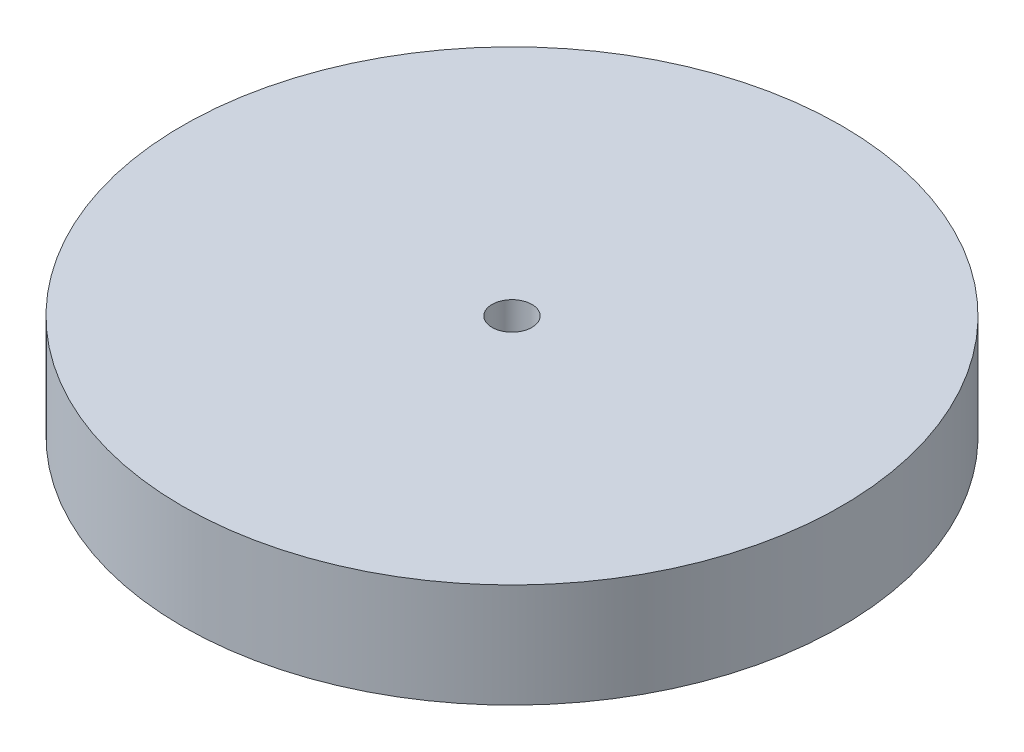
ISO-10303-21;
HEADER;
FILE_DESCRIPTION(('STEP AP214'),'2;1');
FILE_NAME('part.step','',(''),(''),'','','');
FILE_SCHEMA(('AUTOMOTIVE_DESIGN { 1 0 10303 214 1 1 1 1 }'));
ENDSEC;
DATA;
#1=APPLICATION_CONTEXT('core data for automotive mechanical design processes');
#2=APPLICATION_PROTOCOL_DEFINITION('international standard','automotive_design',2000,#1);
#3=PRODUCT_CONTEXT('',#1,'mechanical');
#4=PRODUCT('Part','Part','',(#3));
#5=PRODUCT_RELATED_PRODUCT_CATEGORY('part','',(#4));
#6=PRODUCT_DEFINITION_FORMATION('','',#4);
#7=PRODUCT_DEFINITION_CONTEXT('part definition',#1,'design');
#8=PRODUCT_DEFINITION('design','',#6,#7);
#9=PRODUCT_DEFINITION_SHAPE('','',#8);
#10=(LENGTH_UNIT() NAMED_UNIT(*) SI_UNIT(.MILLI.,.METRE.));
#11=(NAMED_UNIT(*) PLANE_ANGLE_UNIT() SI_UNIT($,.RADIAN.));
#12=(NAMED_UNIT(*) SI_UNIT($,.STERADIAN.) SOLID_ANGLE_UNIT());
#13=UNCERTAINTY_MEASURE_WITH_UNIT(LENGTH_MEASURE(1.E-05),#10,'distance_accuracy_value','');
#14=(GEOMETRIC_REPRESENTATION_CONTEXT(3) GLOBAL_UNCERTAINTY_ASSIGNED_CONTEXT((#13)) GLOBAL_UNIT_ASSIGNED_CONTEXT((#10,
#11,#12)) REPRESENTATION_CONTEXT('',''));
#15=CARTESIAN_POINT('',(0.,0.,0.));
#16=DIRECTION('',(0.,0.,1.));
#17=DIRECTION('',(1.,0.,0.));
#18=AXIS2_PLACEMENT_3D('',#15,#16,#17);
#19=CARTESIAN_POINT('',(0.,-6.,0.));
#20=DIRECTION('',(0.,1.,0.));
#21=DIRECTION('',(0.,0.,1.));
#22=AXIS2_PLACEMENT_3D('',#19,#20,#21);
#23=CYLINDRICAL_SURFACE('',#22,19.);
#24=CARTESIAN_POINT('',(0.,-6.,0.));
#25=DIRECTION('',(0.,1.,0.));
#26=DIRECTION('',(0.,0.,1.));
#27=AXIS2_PLACEMENT_3D('',#24,#25,#26);
#28=CIRCLE('',#27,19.);
#29=CARTESIAN_POINT('',(0.,-6.,19.));
#30=VERTEX_POINT('',#29);
#31=EDGE_CURVE('E10',#30,#30,#28,.T.);
#32=ORIENTED_EDGE('',*,*,#31,.T.);
#33=EDGE_LOOP('',(#32));
#34=FACE_BOUND('',#33,.T.);
#35=CARTESIAN_POINT('',(0.,0.,0.));
#36=DIRECTION('',(0.,1.,0.));
#37=DIRECTION('',(0.,0.,1.));
#38=AXIS2_PLACEMENT_3D('',#35,#36,#37);
#39=CIRCLE('',#38,19.);
#40=CARTESIAN_POINT('',(0.,0.,19.));
#41=VERTEX_POINT('',#40);
#42=EDGE_CURVE('E40',#41,#41,#39,.T.);
#43=ORIENTED_EDGE('',*,*,#42,.F.);
#44=EDGE_LOOP('',(#43));
#45=FACE_BOUND('',#44,.T.);
#46=ADVANCED_FACE('F37',(#34,#45),#23,.T.);
#47=CARTESIAN_POINT('',(0.,-6.,0.));
#48=DIRECTION('',(0.,1.,0.));
#49=DIRECTION('',(0.,0.,1.));
#50=AXIS2_PLACEMENT_3D('',#47,#48,#49);
#51=PLANE('',#50);
#52=CARTESIAN_POINT('',(0.,-6.,0.));
#53=DIRECTION('',(0.,1.,0.));
#54=DIRECTION('',(0.,0.,1.));
#55=AXIS2_PLACEMENT_3D('',#52,#53,#54);
#56=CIRCLE('',#55,1.15);
#57=CARTESIAN_POINT('',(0.,-6.,1.15));
#58=VERTEX_POINT('',#57);
#59=EDGE_CURVE('E49',#58,#58,#56,.T.);
#60=ORIENTED_EDGE('',*,*,#59,.T.);
#61=EDGE_LOOP('',(#60));
#62=FACE_BOUND('',#61,.T.);
#63=ORIENTED_EDGE('',*,*,#31,.F.);
#64=EDGE_LOOP('',(#63));
#65=FACE_BOUND('',#64,.T.);
#66=ADVANCED_FACE('F59',(#62,#65),#51,.F.);
#67=CARTESIAN_POINT('',(0.,0.,0.));
#68=DIRECTION('',(0.,1.,0.));
#69=DIRECTION('',(0.,0.,1.));
#70=AXIS2_PLACEMENT_3D('',#67,#68,#69);
#71=PLANE('',#70);
#72=CARTESIAN_POINT('',(0.,0.,0.));
#73=DIRECTION('',(0.,1.,0.));
#74=DIRECTION('',(0.,0.,1.));
#75=AXIS2_PLACEMENT_3D('',#72,#73,#74);
#76=CIRCLE('',#75,1.15);
#77=CARTESIAN_POINT('',(0.,0.,1.15));
#78=VERTEX_POINT('',#77);
#79=EDGE_CURVE('E51',#78,#78,#76,.T.);
#80=ORIENTED_EDGE('',*,*,#79,.F.);
#81=EDGE_LOOP('',(#80));
#82=FACE_BOUND('',#81,.T.);
#83=ORIENTED_EDGE('',*,*,#42,.T.);
#84=EDGE_LOOP('',(#83));
#85=FACE_BOUND('',#84,.T.);
#86=ADVANCED_FACE('F65',(#82,#85),#71,.T.);
#87=CARTESIAN_POINT('',(0.,-6.,0.));
#88=DIRECTION('',(0.,1.,0.));
#89=DIRECTION('',(0.,0.,1.));
#90=AXIS2_PLACEMENT_3D('',#87,#88,#89);
#91=CYLINDRICAL_SURFACE('',#90,1.15);
#92=ORIENTED_EDGE('',*,*,#59,.F.);
#93=EDGE_LOOP('',(#92));
#94=FACE_BOUND('',#93,.T.);
#95=ORIENTED_EDGE('',*,*,#79,.T.);
#96=EDGE_LOOP('',(#95));
#97=FACE_BOUND('',#96,.T.);
#98=ADVANCED_FACE('F62',(#94,#97),#91,.F.);
#99=CLOSED_SHELL('',(#46,#66,#86,#98));
#100=MANIFOLD_SOLID_BREP('B2',#99);
#101=ADVANCED_BREP_SHAPE_REPRESENTATION('',(#18,#100),#14);
#102=SHAPE_DEFINITION_REPRESENTATION(#9,#101);
ENDSEC;
END-ISO-10303-21;
